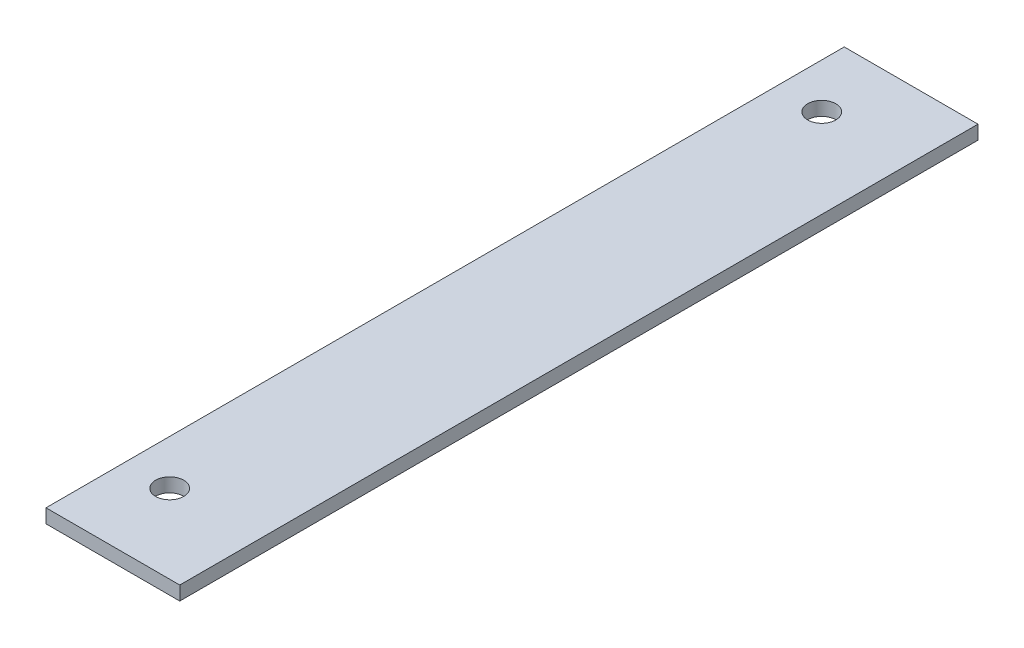
ISO-10303-21;
HEADER;
FILE_DESCRIPTION(('STEP AP214'),'2;1');
FILE_NAME('part.step','',(''),(''),'','','');
FILE_SCHEMA(('AUTOMOTIVE_DESIGN { 1 0 10303 214 1 1 1 1 }'));
ENDSEC;
DATA;
#1=APPLICATION_CONTEXT('core data for automotive mechanical design processes');
#2=APPLICATION_PROTOCOL_DEFINITION('international standard','automotive_design',2000,#1);
#3=PRODUCT_CONTEXT('',#1,'mechanical');
#4=PRODUCT('Part','Part','',(#3));
#5=PRODUCT_RELATED_PRODUCT_CATEGORY('part','',(#4));
#6=PRODUCT_DEFINITION_FORMATION('','',#4);
#7=PRODUCT_DEFINITION_CONTEXT('part definition',#1,'design');
#8=PRODUCT_DEFINITION('design','',#6,#7);
#9=PRODUCT_DEFINITION_SHAPE('','',#8);
#10=(LENGTH_UNIT() NAMED_UNIT(*) SI_UNIT(.MILLI.,.METRE.));
#11=(NAMED_UNIT(*) PLANE_ANGLE_UNIT() SI_UNIT($,.RADIAN.));
#12=(NAMED_UNIT(*) SI_UNIT($,.STERADIAN.) SOLID_ANGLE_UNIT());
#13=UNCERTAINTY_MEASURE_WITH_UNIT(LENGTH_MEASURE(1.E-05),#10,'distance_accuracy_value','');
#14=(GEOMETRIC_REPRESENTATION_CONTEXT(3) GLOBAL_UNCERTAINTY_ASSIGNED_CONTEXT((#13)) GLOBAL_UNIT_ASSIGNED_CONTEXT((#10,
#11,#12)) REPRESENTATION_CONTEXT('',''));
#15=CARTESIAN_POINT('',(0.,0.,0.));
#16=DIRECTION('',(0.,0.,1.));
#17=DIRECTION('',(1.,0.,0.));
#18=AXIS2_PLACEMENT_3D('',#15,#16,#17);
#19=CARTESIAN_POINT('',(7.555,1.57,45.085));
#20=DIRECTION('',(-1.,0.,0.));
#21=DIRECTION('',(0.,0.,1.));
#22=AXIS2_PLACEMENT_3D('',#19,#20,#21);
#23=PLANE('',#22);
#24=DIRECTION('',(0.,0.,-1.));
#25=VECTOR('',#24,1.);
#26=CARTESIAN_POINT('',(7.555,0.,45.085));
#27=LINE('',#26,#25);
#28=CARTESIAN_POINT('',(7.555,0.,45.085));
#29=VERTEX_POINT('',#28);
#30=CARTESIAN_POINT('',(7.555,0.,-45.085));
#31=VERTEX_POINT('',#30);
#32=EDGE_CURVE('E96',#29,#31,#27,.T.);
#33=ORIENTED_EDGE('',*,*,#32,.T.);
#34=DIRECTION('',(0.,-1.,0.));
#35=VECTOR('',#34,1.);
#36=CARTESIAN_POINT('',(7.555,1.57,-45.085));
#37=LINE('',#36,#35);
#38=CARTESIAN_POINT('',(7.555,1.57,-45.085));
#39=VERTEX_POINT('',#38);
#40=EDGE_CURVE('E11',#39,#31,#37,.T.);
#41=ORIENTED_EDGE('',*,*,#40,.F.);
#42=DIRECTION('',(0.,0.,-1.));
#43=VECTOR('',#42,1.);
#44=CARTESIAN_POINT('',(7.555,1.57,45.085));
#45=LINE('',#44,#43);
#46=CARTESIAN_POINT('',(7.555,1.57,45.085));
#47=VERTEX_POINT('',#46);
#48=EDGE_CURVE('E84',#47,#39,#45,.T.);
#49=ORIENTED_EDGE('',*,*,#48,.F.);
#50=DIRECTION('',(0.,-1.,0.));
#51=VECTOR('',#50,1.);
#52=CARTESIAN_POINT('',(7.555,1.57,45.085));
#53=LINE('',#52,#51);
#54=EDGE_CURVE('E92',#47,#29,#53,.T.);
#55=ORIENTED_EDGE('',*,*,#54,.T.);
#56=EDGE_LOOP('',(#33,#41,#49,#55));
#57=FACE_BOUND('',#56,.T.);
#58=ADVANCED_FACE('F33',(#57),#23,.F.);
#59=CARTESIAN_POINT('',(-7.555,1.57,-45.085));
#60=DIRECTION('',(0.,0.,1.));
#61=DIRECTION('',(1.,0.,0.));
#62=AXIS2_PLACEMENT_3D('',#59,#60,#61);
#63=PLANE('',#62);
#64=DIRECTION('',(-1.,0.,0.));
#65=VECTOR('',#64,1.);
#66=CARTESIAN_POINT('',(-7.555,0.,-45.085));
#67=LINE('',#66,#65);
#68=CARTESIAN_POINT('',(-7.555,0.,-45.085));
#69=VERTEX_POINT('',#68);
#70=EDGE_CURVE('E88',#31,#69,#67,.T.);
#71=ORIENTED_EDGE('',*,*,#70,.T.);
#72=DIRECTION('',(0.,-1.,0.));
#73=VECTOR('',#72,1.);
#74=CARTESIAN_POINT('',(-7.555,1.57,-45.085));
#75=LINE('',#74,#73);
#76=CARTESIAN_POINT('',(-7.555,1.57,-45.085));
#77=VERTEX_POINT('',#76);
#78=EDGE_CURVE('E41',#77,#69,#75,.T.);
#79=ORIENTED_EDGE('',*,*,#78,.F.);
#80=DIRECTION('',(-1.,0.,0.));
#81=VECTOR('',#80,1.);
#82=CARTESIAN_POINT('',(-7.555,1.57,-45.085));
#83=LINE('',#82,#81);
#84=EDGE_CURVE('E79',#39,#77,#83,.T.);
#85=ORIENTED_EDGE('',*,*,#84,.F.);
#86=ORIENTED_EDGE('',*,*,#40,.T.);
#87=EDGE_LOOP('',(#71,#79,#85,#86));
#88=FACE_BOUND('',#87,.T.);
#89=ADVANCED_FACE('F87',(#88),#63,.F.);
#90=CARTESIAN_POINT('',(-7.555,1.57,45.085));
#91=DIRECTION('',(1.,0.,0.));
#92=DIRECTION('',(0.,0.,-1.));
#93=AXIS2_PLACEMENT_3D('',#90,#91,#92);
#94=PLANE('',#93);
#95=DIRECTION('',(0.,0.,1.));
#96=VECTOR('',#95,1.);
#97=CARTESIAN_POINT('',(-7.555,0.,45.085));
#98=LINE('',#97,#96);
#99=CARTESIAN_POINT('',(-7.555,0.,45.085));
#100=VERTEX_POINT('',#99);
#101=EDGE_CURVE('E66',#69,#100,#98,.T.);
#102=ORIENTED_EDGE('',*,*,#101,.T.);
#103=DIRECTION('',(0.,-1.,0.));
#104=VECTOR('',#103,1.);
#105=CARTESIAN_POINT('',(-7.555,1.57,45.085));
#106=LINE('',#105,#104);
#107=CARTESIAN_POINT('',(-7.555,1.57,45.085));
#108=VERTEX_POINT('',#107);
#109=EDGE_CURVE('E89',#108,#100,#106,.T.);
#110=ORIENTED_EDGE('',*,*,#109,.F.);
#111=DIRECTION('',(0.,0.,1.));
#112=VECTOR('',#111,1.);
#113=CARTESIAN_POINT('',(-7.555,1.57,45.085));
#114=LINE('',#113,#112);
#115=EDGE_CURVE('E82',#77,#108,#114,.T.);
#116=ORIENTED_EDGE('',*,*,#115,.F.);
#117=ORIENTED_EDGE('',*,*,#78,.T.);
#118=EDGE_LOOP('',(#102,#110,#116,#117));
#119=FACE_BOUND('',#118,.T.);
#120=ADVANCED_FACE('F90',(#119),#94,.F.);
#121=CARTESIAN_POINT('',(-7.555,1.57,45.085));
#122=DIRECTION('',(0.,0.,-1.));
#123=DIRECTION('',(-1.,0.,0.));
#124=AXIS2_PLACEMENT_3D('',#121,#122,#123);
#125=PLANE('',#124);
#126=DIRECTION('',(1.,0.,0.));
#127=VECTOR('',#126,1.);
#128=CARTESIAN_POINT('',(-7.555,0.,45.085));
#129=LINE('',#128,#127);
#130=EDGE_CURVE('E72',#100,#29,#129,.T.);
#131=ORIENTED_EDGE('',*,*,#130,.T.);
#132=ORIENTED_EDGE('',*,*,#54,.F.);
#133=DIRECTION('',(1.,0.,0.));
#134=VECTOR('',#133,1.);
#135=CARTESIAN_POINT('',(-7.555,1.57,45.085));
#136=LINE('',#135,#134);
#137=EDGE_CURVE('E49',#108,#47,#136,.T.);
#138=ORIENTED_EDGE('',*,*,#137,.F.);
#139=ORIENTED_EDGE('',*,*,#109,.T.);
#140=EDGE_LOOP('',(#131,#132,#138,#139));
#141=FACE_BOUND('',#140,.T.);
#142=ADVANCED_FACE('F104',(#141),#125,.F.);
#143=CARTESIAN_POINT('',(0.,1.57,0.));
#144=DIRECTION('',(0.,-1.,0.));
#145=DIRECTION('',(0.,0.,-1.));
#146=AXIS2_PLACEMENT_3D('',#143,#144,#145);
#147=PLANE('',#146);
#148=CARTESIAN_POINT('',(-2.475,1.57,-37.465));
#149=DIRECTION('',(0.,1.,0.));
#150=DIRECTION('',(0.,0.,1.));
#151=AXIS2_PLACEMENT_3D('',#148,#149,#150);
#152=CIRCLE('',#151,1.59);
#153=CARTESIAN_POINT('',(-2.475,1.57,-35.875));
#154=VERTEX_POINT('',#153);
#155=EDGE_CURVE('E116',#154,#154,#152,.T.);
#156=ORIENTED_EDGE('',*,*,#155,.F.);
#157=EDGE_LOOP('',(#156));
#158=FACE_BOUND('',#157,.T.);
#159=CARTESIAN_POINT('',(-2.475,1.57,36.195));
#160=DIRECTION('',(0.,1.,0.));
#161=DIRECTION('',(0.,0.,1.));
#162=AXIS2_PLACEMENT_3D('',#159,#160,#161);
#163=CIRCLE('',#162,1.59);
#164=CARTESIAN_POINT('',(-2.475,1.57,37.785));
#165=VERTEX_POINT('',#164);
#166=EDGE_CURVE('E110',#165,#165,#163,.T.);
#167=ORIENTED_EDGE('',*,*,#166,.F.);
#168=EDGE_LOOP('',(#167));
#169=FACE_BOUND('',#168,.T.);
#170=ORIENTED_EDGE('',*,*,#48,.T.);
#171=ORIENTED_EDGE('',*,*,#84,.T.);
#172=ORIENTED_EDGE('',*,*,#115,.T.);
#173=ORIENTED_EDGE('',*,*,#137,.T.);
#174=EDGE_LOOP('',(#170,#171,#172,#173));
#175=FACE_BOUND('',#174,.T.);
#176=ADVANCED_FACE('F80',(#158,#169,#175),#147,.F.);
#177=CARTESIAN_POINT('',(0.,0.,0.));
#178=DIRECTION('',(0.,-1.,0.));
#179=DIRECTION('',(0.,0.,-1.));
#180=AXIS2_PLACEMENT_3D('',#177,#178,#179);
#181=PLANE('',#180);
#182=CARTESIAN_POINT('',(-2.475,0.,-37.465));
#183=DIRECTION('',(0.,1.,0.));
#184=DIRECTION('',(0.,0.,1.));
#185=AXIS2_PLACEMENT_3D('',#182,#183,#184);
#186=CIRCLE('',#185,1.59);
#187=CARTESIAN_POINT('',(-2.475,0.,-35.875));
#188=VERTEX_POINT('',#187);
#189=EDGE_CURVE('E113',#188,#188,#186,.T.);
#190=ORIENTED_EDGE('',*,*,#189,.T.);
#191=EDGE_LOOP('',(#190));
#192=FACE_BOUND('',#191,.T.);
#193=CARTESIAN_POINT('',(-2.475,0.,36.195));
#194=DIRECTION('',(0.,1.,0.));
#195=DIRECTION('',(0.,0.,1.));
#196=AXIS2_PLACEMENT_3D('',#193,#194,#195);
#197=CIRCLE('',#196,1.59);
#198=CARTESIAN_POINT('',(-2.475,0.,37.785));
#199=VERTEX_POINT('',#198);
#200=EDGE_CURVE('E99',#199,#199,#197,.T.);
#201=ORIENTED_EDGE('',*,*,#200,.T.);
#202=EDGE_LOOP('',(#201));
#203=FACE_BOUND('',#202,.T.);
#204=ORIENTED_EDGE('',*,*,#32,.F.);
#205=ORIENTED_EDGE('',*,*,#130,.F.);
#206=ORIENTED_EDGE('',*,*,#101,.F.);
#207=ORIENTED_EDGE('',*,*,#70,.F.);
#208=EDGE_LOOP('',(#204,#205,#206,#207));
#209=FACE_BOUND('',#208,.T.);
#210=ADVANCED_FACE('F107',(#192,#203,#209),#181,.T.);
#211=CARTESIAN_POINT('',(-2.475,0.,36.195));
#212=DIRECTION('',(0.,1.,0.));
#213=DIRECTION('',(0.,0.,1.));
#214=AXIS2_PLACEMENT_3D('',#211,#212,#213);
#215=CYLINDRICAL_SURFACE('',#214,1.59);
#216=ORIENTED_EDGE('',*,*,#200,.F.);
#217=EDGE_LOOP('',(#216));
#218=FACE_BOUND('',#217,.T.);
#219=ORIENTED_EDGE('',*,*,#166,.T.);
#220=EDGE_LOOP('',(#219));
#221=FACE_BOUND('',#220,.T.);
#222=ADVANCED_FACE('F127',(#218,#221),#215,.F.);
#223=CARTESIAN_POINT('',(-2.475,0.,-37.465));
#224=DIRECTION('',(0.,1.,0.));
#225=DIRECTION('',(0.,0.,1.));
#226=AXIS2_PLACEMENT_3D('',#223,#224,#225);
#227=CYLINDRICAL_SURFACE('',#226,1.59);
#228=ORIENTED_EDGE('',*,*,#189,.F.);
#229=EDGE_LOOP('',(#228));
#230=FACE_BOUND('',#229,.T.);
#231=ORIENTED_EDGE('',*,*,#155,.T.);
#232=EDGE_LOOP('',(#231));
#233=FACE_BOUND('',#232,.T.);
#234=ADVANCED_FACE('F124',(#230,#233),#227,.F.);
#235=CLOSED_SHELL('',(#58,#89,#120,#142,#176,#210,#222,#234));
#236=MANIFOLD_SOLID_BREP('B2',#235);
#237=ADVANCED_BREP_SHAPE_REPRESENTATION('',(#18,#236),#14);
#238=SHAPE_DEFINITION_REPRESENTATION(#9,#237);
ENDSEC;
END-ISO-10303-21;
